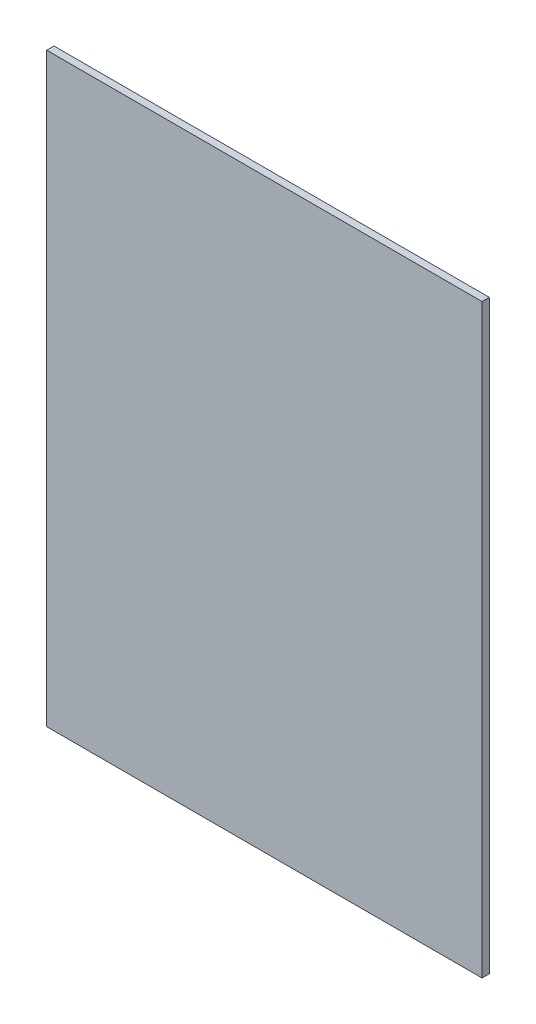
ISO-10303-21;
HEADER;
FILE_DESCRIPTION(('STEP AP214'),'2;1');
FILE_NAME('part.step','',(''),(''),'','','');
FILE_SCHEMA(('AUTOMOTIVE_DESIGN { 1 0 10303 214 1 1 1 1 }'));
ENDSEC;
DATA;
#1=APPLICATION_CONTEXT('core data for automotive mechanical design processes');
#2=APPLICATION_PROTOCOL_DEFINITION('international standard','automotive_design',2000,#1);
#3=PRODUCT_CONTEXT('',#1,'mechanical');
#4=PRODUCT('Part','Part','',(#3));
#5=PRODUCT_RELATED_PRODUCT_CATEGORY('part','',(#4));
#6=PRODUCT_DEFINITION_FORMATION('','',#4);
#7=PRODUCT_DEFINITION_CONTEXT('part definition',#1,'design');
#8=PRODUCT_DEFINITION('design','',#6,#7);
#9=PRODUCT_DEFINITION_SHAPE('','',#8);
#10=(LENGTH_UNIT() NAMED_UNIT(*) SI_UNIT(.MILLI.,.METRE.));
#11=(NAMED_UNIT(*) PLANE_ANGLE_UNIT() SI_UNIT($,.RADIAN.));
#12=(NAMED_UNIT(*) SI_UNIT($,.STERADIAN.) SOLID_ANGLE_UNIT());
#13=UNCERTAINTY_MEASURE_WITH_UNIT(LENGTH_MEASURE(1.E-05),#10,'distance_accuracy_value','');
#14=(GEOMETRIC_REPRESENTATION_CONTEXT(3) GLOBAL_UNCERTAINTY_ASSIGNED_CONTEXT((#13)) GLOBAL_UNIT_ASSIGNED_CONTEXT((#10,
#11,#12)) REPRESENTATION_CONTEXT('',''));
#15=CARTESIAN_POINT('',(0.,0.,0.));
#16=DIRECTION('',(0.,0.,1.));
#17=DIRECTION('',(1.,0.,0.));
#18=AXIS2_PLACEMENT_3D('',#15,#16,#17);
#19=CARTESIAN_POINT('',(60.,80.75,-2.));
#20=DIRECTION('',(1.,0.,0.));
#21=DIRECTION('',(0.,1.,0.));
#22=AXIS2_PLACEMENT_3D('',#19,#20,#21);
#23=PLANE('',#22);
#24=DIRECTION('',(0.,1.,0.));
#25=VECTOR('',#24,1.);
#26=CARTESIAN_POINT('',(60.,80.75,0.));
#27=LINE('',#26,#25);
#28=CARTESIAN_POINT('',(60.,-80.75,0.));
#29=VERTEX_POINT('',#28);
#30=CARTESIAN_POINT('',(60.,80.75,0.));
#31=VERTEX_POINT('',#30);
#32=EDGE_CURVE('E103',#29,#31,#27,.T.);
#33=ORIENTED_EDGE('',*,*,#32,.F.);
#34=DIRECTION('',(0.,0.,1.));
#35=VECTOR('',#34,1.);
#36=CARTESIAN_POINT('',(60.,-80.75,-2.));
#37=LINE('',#36,#35);
#38=CARTESIAN_POINT('',(60.,-80.75,-2.));
#39=VERTEX_POINT('',#38);
#40=EDGE_CURVE('E11',#39,#29,#37,.T.);
#41=ORIENTED_EDGE('',*,*,#40,.F.);
#42=DIRECTION('',(0.,1.,0.));
#43=VECTOR('',#42,1.);
#44=CARTESIAN_POINT('',(60.,80.75,-2.));
#45=LINE('',#44,#43);
#46=CARTESIAN_POINT('',(60.,80.75,-2.));
#47=VERTEX_POINT('',#46);
#48=EDGE_CURVE('E97',#39,#47,#45,.T.);
#49=ORIENTED_EDGE('',*,*,#48,.T.);
#50=DIRECTION('',(0.,0.,1.));
#51=VECTOR('',#50,1.);
#52=CARTESIAN_POINT('',(60.,80.75,-2.));
#53=LINE('',#52,#51);
#54=EDGE_CURVE('E42',#47,#31,#53,.T.);
#55=ORIENTED_EDGE('',*,*,#54,.T.);
#56=EDGE_LOOP('',(#33,#41,#49,#55));
#57=FACE_BOUND('',#56,.T.);
#58=ADVANCED_FACE('F39',(#57),#23,.T.);
#59=CARTESIAN_POINT('',(-60.,-80.75,-2.));
#60=DIRECTION('',(0.,-1.,0.));
#61=DIRECTION('',(0.,0.,-1.));
#62=AXIS2_PLACEMENT_3D('',#59,#60,#61);
#63=PLANE('',#62);
#64=DIRECTION('',(1.,0.,0.));
#65=VECTOR('',#64,1.);
#66=CARTESIAN_POINT('',(-60.,-80.75,0.));
#67=LINE('',#66,#65);
#68=CARTESIAN_POINT('',(-60.,-80.75,0.));
#69=VERTEX_POINT('',#68);
#70=EDGE_CURVE('E99',#69,#29,#67,.T.);
#71=ORIENTED_EDGE('',*,*,#70,.F.);
#72=DIRECTION('',(0.,0.,1.));
#73=VECTOR('',#72,1.);
#74=CARTESIAN_POINT('',(-60.,-80.75,-2.));
#75=LINE('',#74,#73);
#76=CARTESIAN_POINT('',(-60.,-80.75,-2.));
#77=VERTEX_POINT('',#76);
#78=EDGE_CURVE('E48',#77,#69,#75,.T.);
#79=ORIENTED_EDGE('',*,*,#78,.F.);
#80=DIRECTION('',(1.,0.,0.));
#81=VECTOR('',#80,1.);
#82=CARTESIAN_POINT('',(-60.,-80.75,-2.));
#83=LINE('',#82,#81);
#84=EDGE_CURVE('E94',#77,#39,#83,.T.);
#85=ORIENTED_EDGE('',*,*,#84,.T.);
#86=ORIENTED_EDGE('',*,*,#40,.T.);
#87=EDGE_LOOP('',(#71,#79,#85,#86));
#88=FACE_BOUND('',#87,.T.);
#89=ADVANCED_FACE('F113',(#88),#63,.T.);
#90=CARTESIAN_POINT('',(-60.,80.75,-2.));
#91=DIRECTION('',(-1.,0.,0.));
#92=DIRECTION('',(0.,-1.,0.));
#93=AXIS2_PLACEMENT_3D('',#90,#91,#92);
#94=PLANE('',#93);
#95=DIRECTION('',(0.,-1.,0.));
#96=VECTOR('',#95,1.);
#97=CARTESIAN_POINT('',(-60.,80.75,0.));
#98=LINE('',#97,#96);
#99=CARTESIAN_POINT('',(-60.,80.75,0.));
#100=VERTEX_POINT('',#99);
#101=EDGE_CURVE('E89',#100,#69,#98,.T.);
#102=ORIENTED_EDGE('',*,*,#101,.F.);
#103=DIRECTION('',(0.,0.,1.));
#104=VECTOR('',#103,1.);
#105=CARTESIAN_POINT('',(-60.,80.75,-2.));
#106=LINE('',#105,#104);
#107=CARTESIAN_POINT('',(-60.,80.75,-2.));
#108=VERTEX_POINT('',#107);
#109=EDGE_CURVE('E84',#108,#100,#106,.T.);
#110=ORIENTED_EDGE('',*,*,#109,.F.);
#111=DIRECTION('',(0.,-1.,0.));
#112=VECTOR('',#111,1.);
#113=CARTESIAN_POINT('',(-60.,80.75,-2.));
#114=LINE('',#113,#112);
#115=EDGE_CURVE('E87',#108,#77,#114,.T.);
#116=ORIENTED_EDGE('',*,*,#115,.T.);
#117=ORIENTED_EDGE('',*,*,#78,.T.);
#118=EDGE_LOOP('',(#102,#110,#116,#117));
#119=FACE_BOUND('',#118,.T.);
#120=ADVANCED_FACE('F86',(#119),#94,.T.);
#121=CARTESIAN_POINT('',(-60.,80.75,-2.));
#122=DIRECTION('',(0.,1.,0.));
#123=DIRECTION('',(0.,0.,1.));
#124=AXIS2_PLACEMENT_3D('',#121,#122,#123);
#125=PLANE('',#124);
#126=DIRECTION('',(-1.,0.,0.));
#127=VECTOR('',#126,1.);
#128=CARTESIAN_POINT('',(-60.,80.75,0.));
#129=LINE('',#128,#127);
#130=EDGE_CURVE('E106',#31,#100,#129,.T.);
#131=ORIENTED_EDGE('',*,*,#130,.F.);
#132=ORIENTED_EDGE('',*,*,#54,.F.);
#133=DIRECTION('',(-1.,0.,0.));
#134=VECTOR('',#133,1.);
#135=CARTESIAN_POINT('',(-60.,80.75,-2.));
#136=LINE('',#135,#134);
#137=EDGE_CURVE('E93',#47,#108,#136,.T.);
#138=ORIENTED_EDGE('',*,*,#137,.T.);
#139=ORIENTED_EDGE('',*,*,#109,.T.);
#140=EDGE_LOOP('',(#131,#132,#138,#139));
#141=FACE_BOUND('',#140,.T.);
#142=ADVANCED_FACE('F96',(#141),#125,.T.);
#143=CARTESIAN_POINT('',(0.,0.,-2.));
#144=DIRECTION('',(0.,0.,1.));
#145=DIRECTION('',(1.,0.,0.));
#146=AXIS2_PLACEMENT_3D('',#143,#144,#145);
#147=PLANE('',#146);
#148=ORIENTED_EDGE('',*,*,#48,.F.);
#149=ORIENTED_EDGE('',*,*,#84,.F.);
#150=ORIENTED_EDGE('',*,*,#115,.F.);
#151=ORIENTED_EDGE('',*,*,#137,.F.);
#152=EDGE_LOOP('',(#148,#149,#150,#151));
#153=FACE_BOUND('',#152,.T.);
#154=ADVANCED_FACE('F92',(#153),#147,.F.);
#155=CARTESIAN_POINT('',(0.,0.,0.));
#156=DIRECTION('',(0.,0.,1.));
#157=DIRECTION('',(1.,0.,0.));
#158=AXIS2_PLACEMENT_3D('',#155,#156,#157);
#159=PLANE('',#158);
#160=ORIENTED_EDGE('',*,*,#32,.T.);
#161=ORIENTED_EDGE('',*,*,#130,.T.);
#162=ORIENTED_EDGE('',*,*,#101,.T.);
#163=ORIENTED_EDGE('',*,*,#70,.T.);
#164=EDGE_LOOP('',(#160,#161,#162,#163));
#165=FACE_BOUND('',#164,.T.);
#166=ADVANCED_FACE('F112',(#165),#159,.T.);
#167=CLOSED_SHELL('',(#58,#89,#120,#142,#154,#166));
#168=MANIFOLD_SOLID_BREP('B2',#167);
#169=ADVANCED_BREP_SHAPE_REPRESENTATION('',(#18,#168),#14);
#170=SHAPE_DEFINITION_REPRESENTATION(#9,#169);
ENDSEC;
END-ISO-10303-21;
